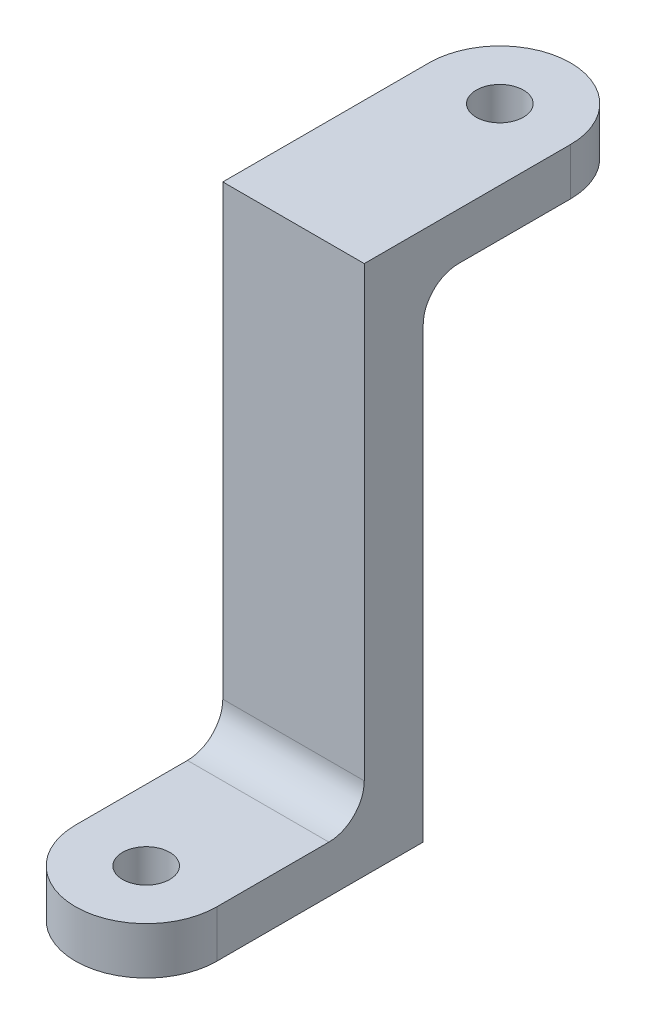
ISO-10303-21;
HEADER;
FILE_DESCRIPTION(('STEP AP214'),'2;1');
FILE_NAME('part.step','',(''),(''),'','','');
FILE_SCHEMA(('AUTOMOTIVE_DESIGN { 1 0 10303 214 1 1 1 1 }'));
ENDSEC;
DATA;
#1=APPLICATION_CONTEXT('core data for automotive mechanical design processes');
#2=APPLICATION_PROTOCOL_DEFINITION('international standard','automotive_design',2000,#1);
#3=PRODUCT_CONTEXT('',#1,'mechanical');
#4=PRODUCT('Part','Part','',(#3));
#5=PRODUCT_RELATED_PRODUCT_CATEGORY('part','',(#4));
#6=PRODUCT_DEFINITION_FORMATION('','',#4);
#7=PRODUCT_DEFINITION_CONTEXT('part definition',#1,'design');
#8=PRODUCT_DEFINITION('design','',#6,#7);
#9=PRODUCT_DEFINITION_SHAPE('','',#8);
#10=(LENGTH_UNIT() NAMED_UNIT(*) SI_UNIT(.MILLI.,.METRE.));
#11=(NAMED_UNIT(*) PLANE_ANGLE_UNIT() SI_UNIT($,.RADIAN.));
#12=(NAMED_UNIT(*) SI_UNIT($,.STERADIAN.) SOLID_ANGLE_UNIT());
#13=UNCERTAINTY_MEASURE_WITH_UNIT(LENGTH_MEASURE(1.E-05),#10,'distance_accuracy_value','');
#14=(GEOMETRIC_REPRESENTATION_CONTEXT(3) GLOBAL_UNCERTAINTY_ASSIGNED_CONTEXT((#13)) GLOBAL_UNIT_ASSIGNED_CONTEXT((#10,
#11,#12)) REPRESENTATION_CONTEXT('',''));
#15=CARTESIAN_POINT('',(0.,0.,0.));
#16=DIRECTION('',(0.,0.,1.));
#17=DIRECTION('',(1.,0.,0.));
#18=AXIS2_PLACEMENT_3D('',#15,#16,#17);
#19=CARTESIAN_POINT('',(6.,4.,0.));
#20=DIRECTION('',(1.,0.,0.));
#21=DIRECTION('',(0.,0.,-1.));
#22=AXIS2_PLACEMENT_3D('',#19,#20,#21);
#23=PLANE('',#22);
#24=DIRECTION('',(0.,0.,1.));
#25=VECTOR('',#24,1.);
#26=CARTESIAN_POINT('',(6.,0.,0.));
#27=LINE('',#26,#25);
#28=CARTESIAN_POINT('',(6.,0.,-17.5));
#29=VERTEX_POINT('',#28);
#30=CARTESIAN_POINT('',(6.,0.,0.));
#31=VERTEX_POINT('',#30);
#32=EDGE_CURVE('E134',#29,#31,#27,.T.);
#33=ORIENTED_EDGE('',*,*,#32,.F.);
#34=DIRECTION('',(0.,-1.,0.));
#35=VECTOR('',#34,1.);
#36=CARTESIAN_POINT('',(6.,41.,-17.5));
#37=LINE('',#36,#35);
#38=CARTESIAN_POINT('',(6.,38.,-17.5));
#39=VERTEX_POINT('',#38);
#40=EDGE_CURVE('E119',#39,#29,#37,.T.);
#41=ORIENTED_EDGE('',*,*,#40,.F.);
#42=CARTESIAN_POINT('',(6.,38.,-20.5));
#43=DIRECTION('',(1.,0.,0.));
#44=DIRECTION('',(0.,0.,-1.));
#45=AXIS2_PLACEMENT_3D('',#42,#43,#44);
#46=CIRCLE('',#45,3.);
#47=CARTESIAN_POINT('',(6.,41.,-20.5));
#48=VERTEX_POINT('',#47);
#49=EDGE_CURVE('E161',#39,#48,#46,.F.);
#50=ORIENTED_EDGE('',*,*,#49,.T.);
#51=DIRECTION('',(0.,0.,-1.));
#52=VECTOR('',#51,1.);
#53=CARTESIAN_POINT('',(6.,41.,0.));
#54=LINE('',#53,#52);
#55=CARTESIAN_POINT('',(6.,41.,-30.));
#56=VERTEX_POINT('',#55);
#57=EDGE_CURVE('E166',#48,#56,#54,.T.);
#58=ORIENTED_EDGE('',*,*,#57,.T.);
#59=DIRECTION('',(0.,-1.,0.));
#60=VECTOR('',#59,1.);
#61=CARTESIAN_POINT('',(6.,45.,-30.));
#62=LINE('',#61,#60);
#63=CARTESIAN_POINT('',(6.,45.,-30.));
#64=VERTEX_POINT('',#63);
#65=EDGE_CURVE('E240',#64,#56,#62,.T.);
#66=ORIENTED_EDGE('',*,*,#65,.F.);
#67=DIRECTION('',(0.,0.,-1.));
#68=VECTOR('',#67,1.);
#69=CARTESIAN_POINT('',(6.,45.,0.));
#70=LINE('',#69,#68);
#71=CARTESIAN_POINT('',(6.,45.,-12.5));
#72=VERTEX_POINT('',#71);
#73=EDGE_CURVE('E261',#72,#64,#70,.T.);
#74=ORIENTED_EDGE('',*,*,#73,.F.);
#75=DIRECTION('',(0.,-1.,0.));
#76=VECTOR('',#75,1.);
#77=CARTESIAN_POINT('',(6.,41.,-12.5));
#78=LINE('',#77,#76);
#79=CARTESIAN_POINT('',(6.,7.,-12.5));
#80=VERTEX_POINT('',#79);
#81=EDGE_CURVE('E138',#72,#80,#78,.T.);
#82=ORIENTED_EDGE('',*,*,#81,.T.);
#83=CARTESIAN_POINT('',(6.,7.,-9.5));
#84=DIRECTION('',(1.,0.,0.));
#85=DIRECTION('',(0.,0.,-1.));
#86=AXIS2_PLACEMENT_3D('',#83,#84,#85);
#87=CIRCLE('',#86,3.);
#88=CARTESIAN_POINT('',(6.,4.,-9.5));
#89=VERTEX_POINT('',#88);
#90=EDGE_CURVE('E11',#80,#89,#87,.F.);
#91=ORIENTED_EDGE('',*,*,#90,.T.);
#92=DIRECTION('',(0.,0.,1.));
#93=VECTOR('',#92,1.);
#94=CARTESIAN_POINT('',(6.,4.,0.));
#95=LINE('',#94,#93);
#96=CARTESIAN_POINT('',(6.,4.,0.));
#97=VERTEX_POINT('',#96);
#98=EDGE_CURVE('E144',#89,#97,#95,.T.);
#99=ORIENTED_EDGE('',*,*,#98,.T.);
#100=DIRECTION('',(0.,-1.,0.));
#101=VECTOR('',#100,1.);
#102=CARTESIAN_POINT('',(6.,4.,0.));
#103=LINE('',#102,#101);
#104=EDGE_CURVE('E145',#97,#31,#103,.T.);
#105=ORIENTED_EDGE('',*,*,#104,.T.);
#106=EDGE_LOOP('',(#33,#41,#50,#58,#66,#74,#82,#91,#99,#105));
#107=FACE_BOUND('',#106,.T.);
#108=ADVANCED_FACE('F35',(#107),#23,.T.);
#109=CARTESIAN_POINT('',(-6.,4.,0.));
#110=DIRECTION('',(1.,0.,0.));
#111=DIRECTION('',(0.,0.,-1.));
#112=AXIS2_PLACEMENT_3D('',#109,#110,#111);
#113=PLANE('',#112);
#114=DIRECTION('',(0.,-1.,0.));
#115=VECTOR('',#114,1.);
#116=CARTESIAN_POINT('',(-6.,41.,-17.5));
#117=LINE('',#116,#115);
#118=CARTESIAN_POINT('',(-6.,38.,-17.5));
#119=VERTEX_POINT('',#118);
#120=CARTESIAN_POINT('',(-6.,0.,-17.5));
#121=VERTEX_POINT('',#120);
#122=EDGE_CURVE('E108',#119,#121,#117,.T.);
#123=ORIENTED_EDGE('',*,*,#122,.T.);
#124=DIRECTION('',(0.,0.,1.));
#125=VECTOR('',#124,1.);
#126=CARTESIAN_POINT('',(-6.,0.,0.));
#127=LINE('',#126,#125);
#128=CARTESIAN_POINT('',(-6.,0.,0.));
#129=VERTEX_POINT('',#128);
#130=EDGE_CURVE('E113',#121,#129,#127,.T.);
#131=ORIENTED_EDGE('',*,*,#130,.T.);
#132=DIRECTION('',(0.,-1.,0.));
#133=VECTOR('',#132,1.);
#134=CARTESIAN_POINT('',(-6.,4.,0.));
#135=LINE('',#134,#133);
#136=CARTESIAN_POINT('',(-6.,4.,0.));
#137=VERTEX_POINT('',#136);
#138=EDGE_CURVE('E148',#137,#129,#135,.T.);
#139=ORIENTED_EDGE('',*,*,#138,.F.);
#140=DIRECTION('',(0.,0.,1.));
#141=VECTOR('',#140,1.);
#142=CARTESIAN_POINT('',(-6.,4.,0.));
#143=LINE('',#142,#141);
#144=CARTESIAN_POINT('',(-6.,4.,-9.5));
#145=VERTEX_POINT('',#144);
#146=EDGE_CURVE('E246',#145,#137,#143,.T.);
#147=ORIENTED_EDGE('',*,*,#146,.F.);
#148=CARTESIAN_POINT('',(-6.,7.,-9.5));
#149=DIRECTION('',(1.,0.,0.));
#150=DIRECTION('',(0.,0.,-1.));
#151=AXIS2_PLACEMENT_3D('',#148,#149,#150);
#152=CIRCLE('',#151,3.);
#153=CARTESIAN_POINT('',(-6.,7.,-12.5));
#154=VERTEX_POINT('',#153);
#155=EDGE_CURVE('E43',#145,#154,#152,.T.);
#156=ORIENTED_EDGE('',*,*,#155,.T.);
#157=DIRECTION('',(0.,-1.,0.));
#158=VECTOR('',#157,1.);
#159=CARTESIAN_POINT('',(-6.,41.,-12.5));
#160=LINE('',#159,#158);
#161=CARTESIAN_POINT('',(-6.,45.,-12.5));
#162=VERTEX_POINT('',#161);
#163=EDGE_CURVE('E120',#162,#154,#160,.T.);
#164=ORIENTED_EDGE('',*,*,#163,.F.);
#165=DIRECTION('',(0.,0.,1.));
#166=VECTOR('',#165,1.);
#167=CARTESIAN_POINT('',(-6.,45.,0.));
#168=LINE('',#167,#166);
#169=CARTESIAN_POINT('',(-6.,45.,-30.));
#170=VERTEX_POINT('',#169);
#171=EDGE_CURVE('E267',#170,#162,#168,.T.);
#172=ORIENTED_EDGE('',*,*,#171,.F.);
#173=DIRECTION('',(0.,-1.,0.));
#174=VECTOR('',#173,1.);
#175=CARTESIAN_POINT('',(-6.,45.,-30.));
#176=LINE('',#175,#174);
#177=CARTESIAN_POINT('',(-6.,41.,-30.));
#178=VERTEX_POINT('',#177);
#179=EDGE_CURVE('E237',#170,#178,#176,.T.);
#180=ORIENTED_EDGE('',*,*,#179,.T.);
#181=DIRECTION('',(0.,0.,1.));
#182=VECTOR('',#181,1.);
#183=CARTESIAN_POINT('',(-6.,41.,0.));
#184=LINE('',#183,#182);
#185=CARTESIAN_POINT('',(-6.,41.,-20.5));
#186=VERTEX_POINT('',#185);
#187=EDGE_CURVE('E234',#178,#186,#184,.T.);
#188=ORIENTED_EDGE('',*,*,#187,.T.);
#189=CARTESIAN_POINT('',(-6.,38.,-20.5));
#190=DIRECTION('',(1.,0.,0.));
#191=DIRECTION('',(0.,0.,-1.));
#192=AXIS2_PLACEMENT_3D('',#189,#190,#191);
#193=CIRCLE('',#192,3.);
#194=EDGE_CURVE('E116',#186,#119,#193,.T.);
#195=ORIENTED_EDGE('',*,*,#194,.T.);
#196=EDGE_LOOP('',(#123,#131,#139,#147,#156,#164,#172,#180,#188,#195));
#197=FACE_BOUND('',#196,.T.);
#198=ADVANCED_FACE('F110',(#197),#113,.F.);
#199=CARTESIAN_POINT('',(0.,0.,0.));
#200=DIRECTION('',(0.,1.,0.));
#201=DIRECTION('',(0.,0.,1.));
#202=AXIS2_PLACEMENT_3D('',#199,#200,#201);
#203=PLANE('',#202);
#204=CARTESIAN_POINT('',(0.,0.,0.));
#205=DIRECTION('',(0.,1.,0.));
#206=DIRECTION('',(0.,0.,1.));
#207=AXIS2_PLACEMENT_3D('',#204,#205,#206);
#208=CIRCLE('',#207,2.);
#209=CARTESIAN_POINT('',(0.,0.,2.));
#210=VERTEX_POINT('',#209);
#211=EDGE_CURVE('E136',#210,#210,#208,.T.);
#212=ORIENTED_EDGE('',*,*,#211,.T.);
#213=EDGE_LOOP('',(#212));
#214=FACE_BOUND('',#213,.T.);
#215=DIRECTION('',(-1.,0.,0.));
#216=VECTOR('',#215,1.);
#217=CARTESIAN_POINT('',(-6.,0.,-17.5));
#218=LINE('',#217,#216);
#219=EDGE_CURVE('E123',#29,#121,#218,.T.);
#220=ORIENTED_EDGE('',*,*,#219,.F.);
#221=ORIENTED_EDGE('',*,*,#32,.T.);
#222=CARTESIAN_POINT('',(0.,0.,0.));
#223=DIRECTION('',(0.,1.,0.));
#224=DIRECTION('',(0.,0.,1.));
#225=AXIS2_PLACEMENT_3D('',#222,#223,#224);
#226=CIRCLE('',#225,6.);
#227=EDGE_CURVE('E133',#129,#31,#226,.T.);
#228=ORIENTED_EDGE('',*,*,#227,.F.);
#229=ORIENTED_EDGE('',*,*,#130,.F.);
#230=EDGE_LOOP('',(#220,#221,#228,#229));
#231=FACE_BOUND('',#230,.T.);
#232=ADVANCED_FACE('F131',(#214,#231),#203,.F.);
#233=CARTESIAN_POINT('',(0.,4.,0.));
#234=DIRECTION('',(0.,1.,0.));
#235=DIRECTION('',(0.,0.,1.));
#236=AXIS2_PLACEMENT_3D('',#233,#234,#235);
#237=PLANE('',#236);
#238=CARTESIAN_POINT('',(0.,4.,0.));
#239=DIRECTION('',(0.,1.,0.));
#240=DIRECTION('',(0.,0.,1.));
#241=AXIS2_PLACEMENT_3D('',#238,#239,#240);
#242=CIRCLE('',#241,2.);
#243=CARTESIAN_POINT('',(0.,4.,2.));
#244=VERTEX_POINT('',#243);
#245=EDGE_CURVE('E149',#244,#244,#242,.T.);
#246=ORIENTED_EDGE('',*,*,#245,.F.);
#247=EDGE_LOOP('',(#246));
#248=FACE_BOUND('',#247,.T.);
#249=ORIENTED_EDGE('',*,*,#98,.F.);
#250=DIRECTION('',(-1.,0.,0.));
#251=VECTOR('',#250,1.);
#252=CARTESIAN_POINT('',(-6.,4.,-9.5));
#253=LINE('',#252,#251);
#254=EDGE_CURVE('E156',#89,#145,#253,.T.);
#255=ORIENTED_EDGE('',*,*,#254,.T.);
#256=ORIENTED_EDGE('',*,*,#146,.T.);
#257=CARTESIAN_POINT('',(0.,4.,0.));
#258=DIRECTION('',(0.,1.,0.));
#259=DIRECTION('',(0.,0.,1.));
#260=AXIS2_PLACEMENT_3D('',#257,#258,#259);
#261=CIRCLE('',#260,6.);
#262=EDGE_CURVE('E248',#137,#97,#261,.T.);
#263=ORIENTED_EDGE('',*,*,#262,.T.);
#264=EDGE_LOOP('',(#249,#255,#256,#263));
#265=FACE_BOUND('',#264,.T.);
#266=ADVANCED_FACE('F202',(#248,#265),#237,.T.);
#267=CARTESIAN_POINT('',(0.,4.,0.));
#268=DIRECTION('',(0.,-1.,0.));
#269=DIRECTION('',(0.,0.,-1.));
#270=AXIS2_PLACEMENT_3D('',#267,#268,#269);
#271=CYLINDRICAL_SURFACE('',#270,2.);
#272=ORIENTED_EDGE('',*,*,#245,.T.);
#273=EDGE_LOOP('',(#272));
#274=FACE_BOUND('',#273,.T.);
#275=ORIENTED_EDGE('',*,*,#211,.F.);
#276=EDGE_LOOP('',(#275));
#277=FACE_BOUND('',#276,.T.);
#278=ADVANCED_FACE('F198',(#274,#277),#271,.F.);
#279=CARTESIAN_POINT('',(0.,4.,0.));
#280=DIRECTION('',(0.,-1.,0.));
#281=DIRECTION('',(0.,0.,-1.));
#282=AXIS2_PLACEMENT_3D('',#279,#280,#281);
#283=CYLINDRICAL_SURFACE('',#282,6.);
#284=ORIENTED_EDGE('',*,*,#227,.T.);
#285=ORIENTED_EDGE('',*,*,#104,.F.);
#286=ORIENTED_EDGE('',*,*,#262,.F.);
#287=ORIENTED_EDGE('',*,*,#138,.T.);
#288=EDGE_LOOP('',(#284,#285,#286,#287));
#289=FACE_BOUND('',#288,.T.);
#290=ADVANCED_FACE('F194',(#289),#283,.T.);
#291=CARTESIAN_POINT('',(6.,41.,-12.5));
#292=DIRECTION('',(0.,0.,1.));
#293=DIRECTION('',(1.,0.,0.));
#294=AXIS2_PLACEMENT_3D('',#291,#292,#293);
#295=PLANE('',#294);
#296=ORIENTED_EDGE('',*,*,#163,.T.);
#297=DIRECTION('',(-1.,0.,0.));
#298=VECTOR('',#297,1.);
#299=CARTESIAN_POINT('',(6.,7.,-12.5));
#300=LINE('',#299,#298);
#301=EDGE_CURVE('E56',#154,#80,#300,.F.);
#302=ORIENTED_EDGE('',*,*,#301,.T.);
#303=ORIENTED_EDGE('',*,*,#81,.F.);
#304=DIRECTION('',(1.,0.,0.));
#305=VECTOR('',#304,1.);
#306=CARTESIAN_POINT('',(0.,45.,-12.5));
#307=LINE('',#306,#305);
#308=EDGE_CURVE('E230',#162,#72,#307,.T.);
#309=ORIENTED_EDGE('',*,*,#308,.F.);
#310=EDGE_LOOP('',(#296,#302,#303,#309));
#311=FACE_BOUND('',#310,.T.);
#312=ADVANCED_FACE('F197',(#311),#295,.T.);
#313=CARTESIAN_POINT('',(6.,41.,-17.5));
#314=DIRECTION('',(0.,0.,1.));
#315=DIRECTION('',(1.,0.,0.));
#316=AXIS2_PLACEMENT_3D('',#313,#314,#315);
#317=PLANE('',#316);
#318=ORIENTED_EDGE('',*,*,#40,.T.);
#319=ORIENTED_EDGE('',*,*,#219,.T.);
#320=ORIENTED_EDGE('',*,*,#122,.F.);
#321=DIRECTION('',(-1.,0.,0.));
#322=VECTOR('',#321,1.);
#323=CARTESIAN_POINT('',(6.,38.,-17.5));
#324=LINE('',#323,#322);
#325=EDGE_CURVE('E154',#119,#39,#324,.F.);
#326=ORIENTED_EDGE('',*,*,#325,.T.);
#327=EDGE_LOOP('',(#318,#319,#320,#326));
#328=FACE_BOUND('',#327,.T.);
#329=ADVANCED_FACE('F124',(#328),#317,.F.);
#330=CARTESIAN_POINT('',(0.,41.,0.));
#331=DIRECTION('',(0.,1.,0.));
#332=DIRECTION('',(0.,0.,1.));
#333=AXIS2_PLACEMENT_3D('',#330,#331,#332);
#334=PLANE('',#333);
#335=CARTESIAN_POINT('',(0.,41.,-30.));
#336=DIRECTION('',(0.,1.,0.));
#337=DIRECTION('',(0.,0.,1.));
#338=AXIS2_PLACEMENT_3D('',#335,#336,#337);
#339=CIRCLE('',#338,2.);
#340=CARTESIAN_POINT('',(0.,41.,-28.));
#341=VERTEX_POINT('',#340);
#342=EDGE_CURVE('E128',#341,#341,#339,.T.);
#343=ORIENTED_EDGE('',*,*,#342,.T.);
#344=EDGE_LOOP('',(#343));
#345=FACE_BOUND('',#344,.T.);
#346=ORIENTED_EDGE('',*,*,#57,.F.);
#347=DIRECTION('',(-1.,0.,0.));
#348=VECTOR('',#347,1.);
#349=CARTESIAN_POINT('',(-6.,41.,-20.5));
#350=LINE('',#349,#348);
#351=EDGE_CURVE('E151',#48,#186,#350,.T.);
#352=ORIENTED_EDGE('',*,*,#351,.T.);
#353=ORIENTED_EDGE('',*,*,#187,.F.);
#354=CARTESIAN_POINT('',(0.,41.,-30.));
#355=DIRECTION('',(0.,1.,0.));
#356=DIRECTION('',(0.,0.,1.));
#357=AXIS2_PLACEMENT_3D('',#354,#355,#356);
#358=CIRCLE('',#357,6.);
#359=EDGE_CURVE('E173',#56,#178,#358,.T.);
#360=ORIENTED_EDGE('',*,*,#359,.F.);
#361=EDGE_LOOP('',(#346,#352,#353,#360));
#362=FACE_BOUND('',#361,.T.);
#363=ADVANCED_FACE('F171',(#345,#362),#334,.F.);
#364=CARTESIAN_POINT('',(0.,45.,-30.));
#365=DIRECTION('',(0.,-1.,0.));
#366=DIRECTION('',(0.,0.,-1.));
#367=AXIS2_PLACEMENT_3D('',#364,#365,#366);
#368=CYLINDRICAL_SURFACE('',#367,6.);
#369=ORIENTED_EDGE('',*,*,#359,.T.);
#370=ORIENTED_EDGE('',*,*,#179,.F.);
#371=CARTESIAN_POINT('',(0.,45.,-30.));
#372=DIRECTION('',(0.,1.,0.));
#373=DIRECTION('',(0.,0.,1.));
#374=AXIS2_PLACEMENT_3D('',#371,#372,#373);
#375=CIRCLE('',#374,6.);
#376=EDGE_CURVE('E268',#64,#170,#375,.T.);
#377=ORIENTED_EDGE('',*,*,#376,.F.);
#378=ORIENTED_EDGE('',*,*,#65,.T.);
#379=EDGE_LOOP('',(#369,#370,#377,#378));
#380=FACE_BOUND('',#379,.T.);
#381=ADVANCED_FACE('F216',(#380),#368,.T.);
#382=CARTESIAN_POINT('',(0.,45.,-30.));
#383=DIRECTION('',(0.,-1.,0.));
#384=DIRECTION('',(0.,0.,-1.));
#385=AXIS2_PLACEMENT_3D('',#382,#383,#384);
#386=CYLINDRICAL_SURFACE('',#385,2.);
#387=CARTESIAN_POINT('',(0.,45.,-30.));
#388=DIRECTION('',(0.,1.,0.));
#389=DIRECTION('',(0.,0.,1.));
#390=AXIS2_PLACEMENT_3D('',#387,#388,#389);
#391=CIRCLE('',#390,2.);
#392=CARTESIAN_POINT('',(0.,45.,-28.));
#393=VERTEX_POINT('',#392);
#394=EDGE_CURVE('E236',#393,#393,#391,.T.);
#395=ORIENTED_EDGE('',*,*,#394,.T.);
#396=EDGE_LOOP('',(#395));
#397=FACE_BOUND('',#396,.T.);
#398=ORIENTED_EDGE('',*,*,#342,.F.);
#399=EDGE_LOOP('',(#398));
#400=FACE_BOUND('',#399,.T.);
#401=ADVANCED_FACE('F184',(#397,#400),#386,.F.);
#402=CARTESIAN_POINT('',(0.,45.,0.));
#403=DIRECTION('',(0.,1.,0.));
#404=DIRECTION('',(0.,0.,1.));
#405=AXIS2_PLACEMENT_3D('',#402,#403,#404);
#406=PLANE('',#405);
#407=ORIENTED_EDGE('',*,*,#394,.F.);
#408=EDGE_LOOP('',(#407));
#409=FACE_BOUND('',#408,.T.);
#410=ORIENTED_EDGE('',*,*,#73,.T.);
#411=ORIENTED_EDGE('',*,*,#376,.T.);
#412=ORIENTED_EDGE('',*,*,#171,.T.);
#413=ORIENTED_EDGE('',*,*,#308,.T.);
#414=EDGE_LOOP('',(#410,#411,#412,#413));
#415=FACE_BOUND('',#414,.T.);
#416=ADVANCED_FACE('F178',(#409,#415),#406,.T.);
#417=CARTESIAN_POINT('',(0.,38.,-20.5));
#418=DIRECTION('',(1.,0.,0.));
#419=DIRECTION('',(0.,0.,-1.));
#420=AXIS2_PLACEMENT_3D('',#417,#418,#419);
#421=CYLINDRICAL_SURFACE('',#420,3.);
#422=ORIENTED_EDGE('',*,*,#49,.F.);
#423=ORIENTED_EDGE('',*,*,#325,.F.);
#424=ORIENTED_EDGE('',*,*,#194,.F.);
#425=ORIENTED_EDGE('',*,*,#351,.F.);
#426=EDGE_LOOP('',(#422,#423,#424,#425));
#427=FACE_BOUND('',#426,.T.);
#428=ADVANCED_FACE('F176',(#427),#421,.F.);
#429=CARTESIAN_POINT('',(0.,7.,-9.5));
#430=DIRECTION('',(1.,0.,0.));
#431=DIRECTION('',(0.,0.,-1.));
#432=AXIS2_PLACEMENT_3D('',#429,#430,#431);
#433=CYLINDRICAL_SURFACE('',#432,3.);
#434=ORIENTED_EDGE('',*,*,#90,.F.);
#435=ORIENTED_EDGE('',*,*,#301,.F.);
#436=ORIENTED_EDGE('',*,*,#155,.F.);
#437=ORIENTED_EDGE('',*,*,#254,.F.);
#438=EDGE_LOOP('',(#434,#435,#436,#437));
#439=FACE_BOUND('',#438,.T.);
#440=ADVANCED_FACE('F37',(#439),#433,.F.);
#441=CLOSED_SHELL('',(#108,#198,#232,#266,#278,#290,#312,#329,#363,#381,#401,#416,#428,#440));
#442=MANIFOLD_SOLID_BREP('B2',#441);
#443=ADVANCED_BREP_SHAPE_REPRESENTATION('',(#18,#442),#14);
#444=SHAPE_DEFINITION_REPRESENTATION(#9,#443);
ENDSEC;
END-ISO-10303-21;
